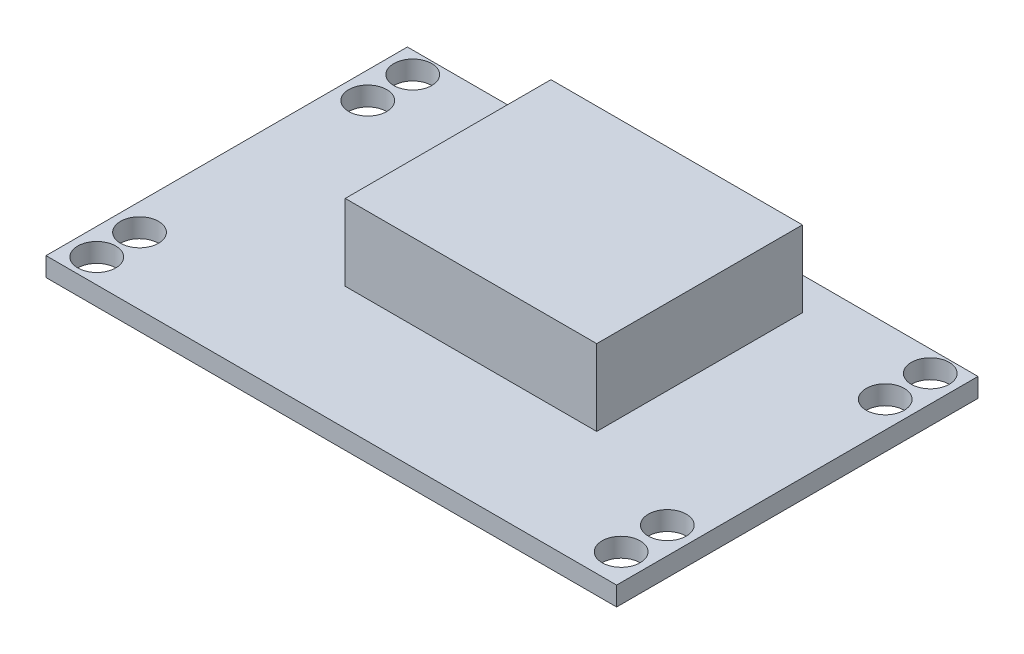
ISO-10303-21;
HEADER;
FILE_DESCRIPTION(('STEP AP214'),'2;1');
FILE_NAME('part.step','',(''),(''),'','','');
FILE_SCHEMA(('AUTOMOTIVE_DESIGN { 1 0 10303 214 1 1 1 1 }'));
ENDSEC;
DATA;
#1=APPLICATION_CONTEXT('core data for automotive mechanical design processes');
#2=APPLICATION_PROTOCOL_DEFINITION('international standard','automotive_design',2000,#1);
#3=PRODUCT_CONTEXT('',#1,'mechanical');
#4=PRODUCT('Part','Part','',(#3));
#5=PRODUCT_RELATED_PRODUCT_CATEGORY('part','',(#4));
#6=PRODUCT_DEFINITION_FORMATION('','',#4);
#7=PRODUCT_DEFINITION_CONTEXT('part definition',#1,'design');
#8=PRODUCT_DEFINITION('design','',#6,#7);
#9=PRODUCT_DEFINITION_SHAPE('','',#8);
#10=(LENGTH_UNIT() NAMED_UNIT(*) SI_UNIT(.MILLI.,.METRE.));
#11=(NAMED_UNIT(*) PLANE_ANGLE_UNIT() SI_UNIT($,.RADIAN.));
#12=(NAMED_UNIT(*) SI_UNIT($,.STERADIAN.) SOLID_ANGLE_UNIT());
#13=UNCERTAINTY_MEASURE_WITH_UNIT(LENGTH_MEASURE(1.E-05),#10,'distance_accuracy_value','');
#14=(GEOMETRIC_REPRESENTATION_CONTEXT(3) GLOBAL_UNCERTAINTY_ASSIGNED_CONTEXT((#13)) GLOBAL_UNIT_ASSIGNED_CONTEXT((#10,
#11,#12)) REPRESENTATION_CONTEXT('',''));
#15=CARTESIAN_POINT('',(0.,0.,0.));
#16=DIRECTION('',(0.,0.,1.));
#17=DIRECTION('',(1.,0.,0.));
#18=AXIS2_PLACEMENT_3D('',#15,#16,#17);
#19=CARTESIAN_POINT('',(0.,1.,0.));
#20=DIRECTION('',(0.,-1.,0.));
#21=DIRECTION('',(0.,0.,-1.));
#22=AXIS2_PLACEMENT_3D('',#19,#20,#21);
#23=PLANE('',#22);
#24=CARTESIAN_POINT('',(28.6035056113575,1.,-1.63484631319741));
#25=DIRECTION('',(0.,1.,0.));
#26=DIRECTION('',(0.,0.,1.));
#27=AXIS2_PLACEMENT_3D('',#24,#25,#26);
#28=CIRCLE('',#27,1.);
#29=CARTESIAN_POINT('',(28.6035056113575,1.,-0.634846313197411));
#30=VERTEX_POINT('',#29);
#31=EDGE_CURVE('E388',#30,#30,#28,.T.);
#32=ORIENTED_EDGE('',*,*,#31,.F.);
#33=EDGE_LOOP('',(#32));
#34=FACE_BOUND('',#33,.T.);
#35=CARTESIAN_POINT('',(1.39649438864245,1.,-1.27369129696668));
#36=DIRECTION('',(0.,1.,0.));
#37=DIRECTION('',(0.,0.,1.));
#38=AXIS2_PLACEMENT_3D('',#35,#36,#37);
#39=CIRCLE('',#38,1.);
#40=CARTESIAN_POINT('',(1.39649438864245,1.,-0.273691296966681));
#41=VERTEX_POINT('',#40);
#42=EDGE_CURVE('E392',#41,#41,#39,.T.);
#43=ORIENTED_EDGE('',*,*,#42,.F.);
#44=EDGE_LOOP('',(#43));
#45=FACE_BOUND('',#44,.T.);
#46=CARTESIAN_POINT('',(1.39649438864245,1.,-3.52087806462456));
#47=DIRECTION('',(0.,1.,0.));
#48=DIRECTION('',(0.,0.,1.));
#49=AXIS2_PLACEMENT_3D('',#46,#47,#48);
#50=CIRCLE('',#49,1.);
#51=CARTESIAN_POINT('',(1.39649438864245,1.,-2.52087806462456));
#52=VERTEX_POINT('',#51);
#53=EDGE_CURVE('E405',#52,#52,#50,.T.);
#54=ORIENTED_EDGE('',*,*,#53,.F.);
#55=EDGE_LOOP('',(#54));
#56=FACE_BOUND('',#55,.T.);
#57=CARTESIAN_POINT('',(1.39649438864245,1.,-15.5192502705122));
#58=DIRECTION('',(0.,1.,0.));
#59=DIRECTION('',(0.,0.,1.));
#60=AXIS2_PLACEMENT_3D('',#57,#58,#59);
#61=CIRCLE('',#60,1.);
#62=CARTESIAN_POINT('',(1.39649438864245,1.,-14.5192502705122));
#63=VERTEX_POINT('',#62);
#64=EDGE_CURVE('E398',#63,#63,#61,.T.);
#65=ORIENTED_EDGE('',*,*,#64,.F.);
#66=EDGE_LOOP('',(#65));
#67=FACE_BOUND('',#66,.T.);
#68=CARTESIAN_POINT('',(28.6035056113575,1.,-15.5192502705122));
#69=DIRECTION('',(0.,1.,0.));
#70=DIRECTION('',(0.,0.,1.));
#71=AXIS2_PLACEMENT_3D('',#68,#69,#70);
#72=CIRCLE('',#71,1.);
#73=CARTESIAN_POINT('',(28.6035056113575,1.,-14.5192502705122));
#74=VERTEX_POINT('',#73);
#75=EDGE_CURVE('E442',#74,#74,#72,.T.);
#76=ORIENTED_EDGE('',*,*,#75,.F.);
#77=EDGE_LOOP('',(#76));
#78=FACE_BOUND('',#77,.T.);
#79=CARTESIAN_POINT('',(28.6035056113575,1.,-17.8868220435803));
#80=DIRECTION('',(0.,1.,0.));
#81=DIRECTION('',(0.,0.,1.));
#82=AXIS2_PLACEMENT_3D('',#79,#80,#81);
#83=CIRCLE('',#82,1.);
#84=CARTESIAN_POINT('',(28.6035056113575,1.,-16.8868220435803));
#85=VERTEX_POINT('',#84);
#86=EDGE_CURVE('E441',#85,#85,#83,.T.);
#87=ORIENTED_EDGE('',*,*,#86,.F.);
#88=EDGE_LOOP('',(#87));
#89=FACE_BOUND('',#88,.T.);
#90=CARTESIAN_POINT('',(28.6035056113575,1.,-4.06261058897066));
#91=DIRECTION('',(0.,1.,0.));
#92=DIRECTION('',(0.,0.,1.));
#93=AXIS2_PLACEMENT_3D('',#90,#91,#92);
#94=CIRCLE('',#93,1.);
#95=CARTESIAN_POINT('',(28.6035056113575,1.,-3.06261058897066));
#96=VERTEX_POINT('',#95);
#97=EDGE_CURVE('E394',#96,#96,#94,.T.);
#98=ORIENTED_EDGE('',*,*,#97,.F.);
#99=EDGE_LOOP('',(#98));
#100=FACE_BOUND('',#99,.T.);
#101=CARTESIAN_POINT('',(1.39649438864245,1.,-17.8868220435803));
#102=DIRECTION('',(0.,1.,0.));
#103=DIRECTION('',(0.,0.,1.));
#104=AXIS2_PLACEMENT_3D('',#101,#102,#103);
#105=CIRCLE('',#104,1.);
#106=CARTESIAN_POINT('',(1.39649438864245,1.,-16.8868220435803));
#107=VERTEX_POINT('',#106);
#108=EDGE_CURVE('E401',#107,#107,#105,.T.);
#109=ORIENTED_EDGE('',*,*,#108,.F.);
#110=EDGE_LOOP('',(#109));
#111=FACE_BOUND('',#110,.T.);
#112=DIRECTION('',(0.,0.,1.));
#113=VECTOR('',#112,1.);
#114=CARTESIAN_POINT('',(0.,1.,0.));
#115=LINE('',#114,#113);
#116=CARTESIAN_POINT('',(0.,1.,-19.));
#117=VERTEX_POINT('',#116);
#118=CARTESIAN_POINT('',(0.,1.,0.));
#119=VERTEX_POINT('',#118);
#120=EDGE_CURVE('E131',#117,#119,#115,.T.);
#121=ORIENTED_EDGE('',*,*,#120,.T.);
#122=DIRECTION('',(1.,0.,0.));
#123=VECTOR('',#122,1.);
#124=CARTESIAN_POINT('',(0.,1.,0.));
#125=LINE('',#124,#123);
#126=CARTESIAN_POINT('',(30.,1.,0.));
#127=VERTEX_POINT('',#126);
#128=EDGE_CURVE('E134',#119,#127,#125,.T.);
#129=ORIENTED_EDGE('',*,*,#128,.T.);
#130=DIRECTION('',(0.,0.,-1.));
#131=VECTOR('',#130,1.);
#132=CARTESIAN_POINT('',(30.,1.,0.));
#133=LINE('',#132,#131);
#134=CARTESIAN_POINT('',(30.,1.,-19.));
#135=VERTEX_POINT('',#134);
#136=EDGE_CURVE('E137',#127,#135,#133,.T.);
#137=ORIENTED_EDGE('',*,*,#136,.T.);
#138=DIRECTION('',(-1.,0.,0.));
#139=VECTOR('',#138,1.);
#140=CARTESIAN_POINT('',(0.,1.,-19.));
#141=LINE('',#140,#139);
#142=EDGE_CURVE('E139',#135,#117,#141,.T.);
#143=ORIENTED_EDGE('',*,*,#142,.T.);
#144=EDGE_LOOP('',(#121,#129,#137,#143));
#145=FACE_BOUND('',#144,.T.);
#146=DIRECTION('',(0.,0.,1.));
#147=VECTOR('',#146,1.);
#148=CARTESIAN_POINT('',(9.26164807544505,1.,-17.2848970165291));
#149=LINE('',#148,#147);
#150=CARTESIAN_POINT('',(9.26164807544505,1.,-17.2848970165291));
#151=VERTEX_POINT('',#150);
#152=CARTESIAN_POINT('',(9.26164807544505,1.,-6.47031069717554));
#153=VERTEX_POINT('',#152);
#154=EDGE_CURVE('E52',#151,#153,#149,.T.);
#155=ORIENTED_EDGE('',*,*,#154,.F.);
#156=DIRECTION('',(-1.,0.,0.));
#157=VECTOR('',#156,1.);
#158=CARTESIAN_POINT('',(9.26164807544505,1.,-17.2848970165291));
#159=LINE('',#158,#157);
#160=CARTESIAN_POINT('',(22.4839345030035,1.,-17.2848970165291));
#161=VERTEX_POINT('',#160);
#162=EDGE_CURVE('E56',#161,#151,#159,.T.);
#163=ORIENTED_EDGE('',*,*,#162,.F.);
#164=DIRECTION('',(0.,0.,-1.));
#165=VECTOR('',#164,1.);
#166=CARTESIAN_POINT('',(22.4839345030035,1.,-17.2848970165291));
#167=LINE('',#166,#165);
#168=CARTESIAN_POINT('',(22.4839345030035,1.,-6.47031069717554));
#169=VERTEX_POINT('',#168);
#170=EDGE_CURVE('E422',#169,#161,#167,.T.);
#171=ORIENTED_EDGE('',*,*,#170,.F.);
#172=DIRECTION('',(1.,0.,0.));
#173=VECTOR('',#172,1.);
#174=CARTESIAN_POINT('',(9.26164807544505,1.,-6.47031069717554));
#175=LINE('',#174,#173);
#176=EDGE_CURVE('E420',#153,#169,#175,.T.);
#177=ORIENTED_EDGE('',*,*,#176,.F.);
#178=EDGE_LOOP('',(#155,#163,#171,#177));
#179=FACE_BOUND('',#178,.T.);
#180=ADVANCED_FACE('F37',(#34,#45,#56,#67,#78,#89,#100,#111,#145,#179),#23,.F.);
#181=CARTESIAN_POINT('',(0.,1.,0.));
#182=DIRECTION('',(1.,0.,0.));
#183=DIRECTION('',(0.,0.,-1.));
#184=AXIS2_PLACEMENT_3D('',#181,#182,#183);
#185=PLANE('',#184);
#186=DIRECTION('',(0.,0.,1.));
#187=VECTOR('',#186,1.);
#188=CARTESIAN_POINT('',(0.,0.,0.));
#189=LINE('',#188,#187);
#190=CARTESIAN_POINT('',(0.,0.,-19.));
#191=VERTEX_POINT('',#190);
#192=CARTESIAN_POINT('',(0.,0.,0.));
#193=VERTEX_POINT('',#192);
#194=EDGE_CURVE('E122',#191,#193,#189,.T.);
#195=ORIENTED_EDGE('',*,*,#194,.T.);
#196=DIRECTION('',(0.,-1.,0.));
#197=VECTOR('',#196,1.);
#198=CARTESIAN_POINT('',(0.,1.,0.));
#199=LINE('',#198,#197);
#200=EDGE_CURVE('E11',#119,#193,#199,.T.);
#201=ORIENTED_EDGE('',*,*,#200,.F.);
#202=ORIENTED_EDGE('',*,*,#120,.F.);
#203=DIRECTION('',(0.,-1.,0.));
#204=VECTOR('',#203,1.);
#205=CARTESIAN_POINT('',(0.,1.,-19.));
#206=LINE('',#205,#204);
#207=EDGE_CURVE('E140',#117,#191,#206,.T.);
#208=ORIENTED_EDGE('',*,*,#207,.T.);
#209=EDGE_LOOP('',(#195,#201,#202,#208));
#210=FACE_BOUND('',#209,.T.);
#211=ADVANCED_FACE('F39',(#210),#185,.F.);
#212=CARTESIAN_POINT('',(0.,1.,0.));
#213=DIRECTION('',(0.,0.,-1.));
#214=DIRECTION('',(-1.,0.,0.));
#215=AXIS2_PLACEMENT_3D('',#212,#213,#214);
#216=PLANE('',#215);
#217=DIRECTION('',(1.,0.,0.));
#218=VECTOR('',#217,1.);
#219=CARTESIAN_POINT('',(0.,0.,0.));
#220=LINE('',#219,#218);
#221=CARTESIAN_POINT('',(30.,0.,0.));
#222=VERTEX_POINT('',#221);
#223=EDGE_CURVE('E125',#193,#222,#220,.T.);
#224=ORIENTED_EDGE('',*,*,#223,.T.);
#225=DIRECTION('',(0.,-1.,0.));
#226=VECTOR('',#225,1.);
#227=CARTESIAN_POINT('',(30.,1.,0.));
#228=LINE('',#227,#226);
#229=EDGE_CURVE('E45',#127,#222,#228,.T.);
#230=ORIENTED_EDGE('',*,*,#229,.F.);
#231=ORIENTED_EDGE('',*,*,#128,.F.);
#232=ORIENTED_EDGE('',*,*,#200,.T.);
#233=EDGE_LOOP('',(#224,#230,#231,#232));
#234=FACE_BOUND('',#233,.T.);
#235=ADVANCED_FACE('F170',(#234),#216,.F.);
#236=CARTESIAN_POINT('',(30.,1.,0.));
#237=DIRECTION('',(-1.,0.,0.));
#238=DIRECTION('',(0.,0.,1.));
#239=AXIS2_PLACEMENT_3D('',#236,#237,#238);
#240=PLANE('',#239);
#241=DIRECTION('',(0.,0.,-1.));
#242=VECTOR('',#241,1.);
#243=CARTESIAN_POINT('',(30.,0.,0.));
#244=LINE('',#243,#242);
#245=CARTESIAN_POINT('',(30.,0.,-19.));
#246=VERTEX_POINT('',#245);
#247=EDGE_CURVE('E143',#222,#246,#244,.T.);
#248=ORIENTED_EDGE('',*,*,#247,.T.);
#249=DIRECTION('',(0.,-1.,0.));
#250=VECTOR('',#249,1.);
#251=CARTESIAN_POINT('',(30.,1.,-19.));
#252=LINE('',#251,#250);
#253=EDGE_CURVE('E148',#135,#246,#252,.T.);
#254=ORIENTED_EDGE('',*,*,#253,.F.);
#255=ORIENTED_EDGE('',*,*,#136,.F.);
#256=ORIENTED_EDGE('',*,*,#229,.T.);
#257=EDGE_LOOP('',(#248,#254,#255,#256));
#258=FACE_BOUND('',#257,.T.);
#259=ADVANCED_FACE('F155',(#258),#240,.F.);
#260=CARTESIAN_POINT('',(0.,1.,-19.));
#261=DIRECTION('',(0.,0.,1.));
#262=DIRECTION('',(1.,0.,0.));
#263=AXIS2_PLACEMENT_3D('',#260,#261,#262);
#264=PLANE('',#263);
#265=DIRECTION('',(-1.,0.,0.));
#266=VECTOR('',#265,1.);
#267=CARTESIAN_POINT('',(0.,0.,-19.));
#268=LINE('',#267,#266);
#269=EDGE_CURVE('E135',#246,#191,#268,.T.);
#270=ORIENTED_EDGE('',*,*,#269,.T.);
#271=ORIENTED_EDGE('',*,*,#207,.F.);
#272=ORIENTED_EDGE('',*,*,#142,.F.);
#273=ORIENTED_EDGE('',*,*,#253,.T.);
#274=EDGE_LOOP('',(#270,#271,#272,#273));
#275=FACE_BOUND('',#274,.T.);
#276=ADVANCED_FACE('F164',(#275),#264,.F.);
#277=CARTESIAN_POINT('',(0.,0.,0.));
#278=DIRECTION('',(0.,-1.,0.));
#279=DIRECTION('',(0.,0.,-1.));
#280=AXIS2_PLACEMENT_3D('',#277,#278,#279);
#281=PLANE('',#280);
#282=CARTESIAN_POINT('',(28.6035056113575,0.,-1.63484631319741));
#283=DIRECTION('',(0.,1.,0.));
#284=DIRECTION('',(0.,0.,1.));
#285=AXIS2_PLACEMENT_3D('',#282,#283,#284);
#286=CIRCLE('',#285,1.);
#287=CARTESIAN_POINT('',(28.6035056113575,0.,-0.634846313197411));
#288=VERTEX_POINT('',#287);
#289=EDGE_CURVE('E386',#288,#288,#286,.T.);
#290=ORIENTED_EDGE('',*,*,#289,.T.);
#291=EDGE_LOOP('',(#290));
#292=FACE_BOUND('',#291,.T.);
#293=CARTESIAN_POINT('',(1.39649438864245,0.,-1.27369129696668));
#294=DIRECTION('',(0.,1.,0.));
#295=DIRECTION('',(0.,0.,1.));
#296=AXIS2_PLACEMENT_3D('',#293,#294,#295);
#297=CIRCLE('',#296,1.);
#298=CARTESIAN_POINT('',(1.39649438864245,0.,-0.273691296966681));
#299=VERTEX_POINT('',#298);
#300=EDGE_CURVE('E389',#299,#299,#297,.T.);
#301=ORIENTED_EDGE('',*,*,#300,.T.);
#302=EDGE_LOOP('',(#301));
#303=FACE_BOUND('',#302,.T.);
#304=CARTESIAN_POINT('',(1.39649438864245,0.,-3.52087806462456));
#305=DIRECTION('',(0.,1.,0.));
#306=DIRECTION('',(0.,0.,1.));
#307=AXIS2_PLACEMENT_3D('',#304,#305,#306);
#308=CIRCLE('',#307,1.);
#309=CARTESIAN_POINT('',(1.39649438864245,0.,-2.52087806462456));
#310=VERTEX_POINT('',#309);
#311=EDGE_CURVE('E408',#310,#310,#308,.T.);
#312=ORIENTED_EDGE('',*,*,#311,.T.);
#313=EDGE_LOOP('',(#312));
#314=FACE_BOUND('',#313,.T.);
#315=CARTESIAN_POINT('',(1.39649438864245,0.,-15.5192502705122));
#316=DIRECTION('',(0.,1.,0.));
#317=DIRECTION('',(0.,0.,1.));
#318=AXIS2_PLACEMENT_3D('',#315,#316,#317);
#319=CIRCLE('',#318,1.);
#320=CARTESIAN_POINT('',(1.39649438864245,0.,-14.5192502705122));
#321=VERTEX_POINT('',#320);
#322=EDGE_CURVE('E402',#321,#321,#319,.T.);
#323=ORIENTED_EDGE('',*,*,#322,.T.);
#324=EDGE_LOOP('',(#323));
#325=FACE_BOUND('',#324,.T.);
#326=CARTESIAN_POINT('',(28.6035056113575,0.,-15.5192502705122));
#327=DIRECTION('',(0.,1.,0.));
#328=DIRECTION('',(0.,0.,1.));
#329=AXIS2_PLACEMENT_3D('',#326,#327,#328);
#330=CIRCLE('',#329,1.);
#331=CARTESIAN_POINT('',(28.6035056113575,0.,-14.5192502705122));
#332=VERTEX_POINT('',#331);
#333=EDGE_CURVE('E450',#332,#332,#330,.T.);
#334=ORIENTED_EDGE('',*,*,#333,.T.);
#335=EDGE_LOOP('',(#334));
#336=FACE_BOUND('',#335,.T.);
#337=CARTESIAN_POINT('',(28.6035056113575,0.,-17.8868220435803));
#338=DIRECTION('',(0.,1.,0.));
#339=DIRECTION('',(0.,0.,1.));
#340=AXIS2_PLACEMENT_3D('',#337,#338,#339);
#341=CIRCLE('',#340,1.);
#342=CARTESIAN_POINT('',(28.6035056113575,0.,-16.8868220435803));
#343=VERTEX_POINT('',#342);
#344=EDGE_CURVE('E438',#343,#343,#341,.T.);
#345=ORIENTED_EDGE('',*,*,#344,.T.);
#346=EDGE_LOOP('',(#345));
#347=FACE_BOUND('',#346,.T.);
#348=CARTESIAN_POINT('',(28.6035056113575,0.,-4.06261058897066));
#349=DIRECTION('',(0.,1.,0.));
#350=DIRECTION('',(0.,0.,1.));
#351=AXIS2_PLACEMENT_3D('',#348,#349,#350);
#352=CIRCLE('',#351,1.);
#353=CARTESIAN_POINT('',(28.6035056113575,0.,-3.06261058897066));
#354=VERTEX_POINT('',#353);
#355=EDGE_CURVE('E445',#354,#354,#352,.T.);
#356=ORIENTED_EDGE('',*,*,#355,.T.);
#357=EDGE_LOOP('',(#356));
#358=FACE_BOUND('',#357,.T.);
#359=CARTESIAN_POINT('',(1.39649438864245,0.,-17.8868220435803));
#360=DIRECTION('',(0.,1.,0.));
#361=DIRECTION('',(0.,0.,1.));
#362=AXIS2_PLACEMENT_3D('',#359,#360,#361);
#363=CIRCLE('',#362,1.);
#364=CARTESIAN_POINT('',(1.39649438864245,0.,-16.8868220435803));
#365=VERTEX_POINT('',#364);
#366=EDGE_CURVE('E411',#365,#365,#363,.T.);
#367=ORIENTED_EDGE('',*,*,#366,.T.);
#368=EDGE_LOOP('',(#367));
#369=FACE_BOUND('',#368,.T.);
#370=ORIENTED_EDGE('',*,*,#194,.F.);
#371=ORIENTED_EDGE('',*,*,#269,.F.);
#372=ORIENTED_EDGE('',*,*,#247,.F.);
#373=ORIENTED_EDGE('',*,*,#223,.F.);
#374=EDGE_LOOP('',(#370,#371,#372,#373));
#375=FACE_BOUND('',#374,.T.);
#376=ADVANCED_FACE('F161',(#292,#303,#314,#325,#336,#347,#358,#369,#375),#281,.T.);
#377=CARTESIAN_POINT('',(9.26164807544505,5.,-17.2848970165291));
#378=DIRECTION('',(1.,0.,0.));
#379=DIRECTION('',(0.,0.,-1.));
#380=AXIS2_PLACEMENT_3D('',#377,#378,#379);
#381=PLANE('',#380);
#382=ORIENTED_EDGE('',*,*,#154,.T.);
#383=DIRECTION('',(0.,-1.,0.));
#384=VECTOR('',#383,1.);
#385=CARTESIAN_POINT('',(9.26164807544505,5.,-6.47031069717554));
#386=LINE('',#385,#384);
#387=CARTESIAN_POINT('',(9.26164807544505,5.,-6.47031069717554));
#388=VERTEX_POINT('',#387);
#389=EDGE_CURVE('E105',#388,#153,#386,.T.);
#390=ORIENTED_EDGE('',*,*,#389,.F.);
#391=DIRECTION('',(0.,0.,1.));
#392=VECTOR('',#391,1.);
#393=CARTESIAN_POINT('',(9.26164807544505,5.,-17.2848970165291));
#394=LINE('',#393,#392);
#395=CARTESIAN_POINT('',(9.26164807544505,5.,-17.2848970165291));
#396=VERTEX_POINT('',#395);
#397=EDGE_CURVE('E111',#396,#388,#394,.T.);
#398=ORIENTED_EDGE('',*,*,#397,.F.);
#399=DIRECTION('',(0.,-1.,0.));
#400=VECTOR('',#399,1.);
#401=CARTESIAN_POINT('',(9.26164807544505,5.,-17.2848970165291));
#402=LINE('',#401,#400);
#403=EDGE_CURVE('E418',#396,#151,#402,.T.);
#404=ORIENTED_EDGE('',*,*,#403,.T.);
#405=EDGE_LOOP('',(#382,#390,#398,#404));
#406=FACE_BOUND('',#405,.T.);
#407=ADVANCED_FACE('F121',(#406),#381,.F.);
#408=CARTESIAN_POINT('',(9.26164807544505,5.,-6.47031069717554));
#409=DIRECTION('',(0.,0.,-1.));
#410=DIRECTION('',(-1.,0.,0.));
#411=AXIS2_PLACEMENT_3D('',#408,#409,#410);
#412=PLANE('',#411);
#413=ORIENTED_EDGE('',*,*,#176,.T.);
#414=DIRECTION('',(0.,-1.,0.));
#415=VECTOR('',#414,1.);
#416=CARTESIAN_POINT('',(22.4839345030035,5.,-6.47031069717554));
#417=LINE('',#416,#415);
#418=CARTESIAN_POINT('',(22.4839345030035,5.,-6.47031069717554));
#419=VERTEX_POINT('',#418);
#420=EDGE_CURVE('E107',#419,#169,#417,.T.);
#421=ORIENTED_EDGE('',*,*,#420,.F.);
#422=DIRECTION('',(1.,0.,0.));
#423=VECTOR('',#422,1.);
#424=CARTESIAN_POINT('',(9.26164807544505,5.,-6.47031069717554));
#425=LINE('',#424,#423);
#426=EDGE_CURVE('E100',#388,#419,#425,.T.);
#427=ORIENTED_EDGE('',*,*,#426,.F.);
#428=ORIENTED_EDGE('',*,*,#389,.T.);
#429=EDGE_LOOP('',(#413,#421,#427,#428));
#430=FACE_BOUND('',#429,.T.);
#431=ADVANCED_FACE('F103',(#430),#412,.F.);
#432=CARTESIAN_POINT('',(22.4839345030035,5.,-17.2848970165291));
#433=DIRECTION('',(-1.,0.,0.));
#434=DIRECTION('',(0.,0.,1.));
#435=AXIS2_PLACEMENT_3D('',#432,#433,#434);
#436=PLANE('',#435);
#437=ORIENTED_EDGE('',*,*,#170,.T.);
#438=DIRECTION('',(0.,-1.,0.));
#439=VECTOR('',#438,1.);
#440=CARTESIAN_POINT('',(22.4839345030035,5.,-17.2848970165291));
#441=LINE('',#440,#439);
#442=CARTESIAN_POINT('',(22.4839345030035,5.,-17.2848970165291));
#443=VERTEX_POINT('',#442);
#444=EDGE_CURVE('E127',#443,#161,#441,.T.);
#445=ORIENTED_EDGE('',*,*,#444,.F.);
#446=DIRECTION('',(0.,0.,-1.));
#447=VECTOR('',#446,1.);
#448=CARTESIAN_POINT('',(22.4839345030035,5.,-17.2848970165291));
#449=LINE('',#448,#447);
#450=EDGE_CURVE('E110',#419,#443,#449,.T.);
#451=ORIENTED_EDGE('',*,*,#450,.F.);
#452=ORIENTED_EDGE('',*,*,#420,.T.);
#453=EDGE_LOOP('',(#437,#445,#451,#452));
#454=FACE_BOUND('',#453,.T.);
#455=ADVANCED_FACE('F211',(#454),#436,.F.);
#456=CARTESIAN_POINT('',(9.26164807544505,5.,-17.2848970165291));
#457=DIRECTION('',(0.,0.,1.));
#458=DIRECTION('',(1.,0.,0.));
#459=AXIS2_PLACEMENT_3D('',#456,#457,#458);
#460=PLANE('',#459);
#461=ORIENTED_EDGE('',*,*,#162,.T.);
#462=ORIENTED_EDGE('',*,*,#403,.F.);
#463=DIRECTION('',(-1.,0.,0.));
#464=VECTOR('',#463,1.);
#465=CARTESIAN_POINT('',(9.26164807544505,5.,-17.2848970165291));
#466=LINE('',#465,#464);
#467=EDGE_CURVE('E116',#443,#396,#466,.T.);
#468=ORIENTED_EDGE('',*,*,#467,.F.);
#469=ORIENTED_EDGE('',*,*,#444,.T.);
#470=EDGE_LOOP('',(#461,#462,#468,#469));
#471=FACE_BOUND('',#470,.T.);
#472=ADVANCED_FACE('F217',(#471),#460,.F.);
#473=CARTESIAN_POINT('',(0.,5.,0.));
#474=DIRECTION('',(0.,1.,0.));
#475=DIRECTION('',(0.,0.,1.));
#476=AXIS2_PLACEMENT_3D('',#473,#474,#475);
#477=PLANE('',#476);
#478=ORIENTED_EDGE('',*,*,#397,.T.);
#479=ORIENTED_EDGE('',*,*,#426,.T.);
#480=ORIENTED_EDGE('',*,*,#450,.T.);
#481=ORIENTED_EDGE('',*,*,#467,.T.);
#482=EDGE_LOOP('',(#478,#479,#480,#481));
#483=FACE_BOUND('',#482,.T.);
#484=ADVANCED_FACE('F114',(#483),#477,.T.);
#485=CARTESIAN_POINT('',(1.39649438864245,0.,-17.8868220435803));
#486=DIRECTION('',(0.,1.,0.));
#487=DIRECTION('',(0.,0.,1.));
#488=AXIS2_PLACEMENT_3D('',#485,#486,#487);
#489=CYLINDRICAL_SURFACE('',#488,1.);
#490=ORIENTED_EDGE('',*,*,#366,.F.);
#491=EDGE_LOOP('',(#490));
#492=FACE_BOUND('',#491,.T.);
#493=ORIENTED_EDGE('',*,*,#108,.T.);
#494=EDGE_LOOP('',(#493));
#495=FACE_BOUND('',#494,.T.);
#496=ADVANCED_FACE('F232',(#492,#495),#489,.F.);
#497=CARTESIAN_POINT('',(28.6035056113575,0.,-4.06261058897066));
#498=DIRECTION('',(0.,1.,0.));
#499=DIRECTION('',(0.,0.,1.));
#500=AXIS2_PLACEMENT_3D('',#497,#498,#499);
#501=CYLINDRICAL_SURFACE('',#500,1.);
#502=ORIENTED_EDGE('',*,*,#355,.F.);
#503=EDGE_LOOP('',(#502));
#504=FACE_BOUND('',#503,.T.);
#505=ORIENTED_EDGE('',*,*,#97,.T.);
#506=EDGE_LOOP('',(#505));
#507=FACE_BOUND('',#506,.T.);
#508=ADVANCED_FACE('F238',(#504,#507),#501,.F.);
#509=CARTESIAN_POINT('',(28.6035056113575,0.,-17.8868220435803));
#510=DIRECTION('',(0.,1.,0.));
#511=DIRECTION('',(0.,0.,1.));
#512=AXIS2_PLACEMENT_3D('',#509,#510,#511);
#513=CYLINDRICAL_SURFACE('',#512,1.);
#514=ORIENTED_EDGE('',*,*,#344,.F.);
#515=EDGE_LOOP('',(#514));
#516=FACE_BOUND('',#515,.T.);
#517=ORIENTED_EDGE('',*,*,#86,.T.);
#518=EDGE_LOOP('',(#517));
#519=FACE_BOUND('',#518,.T.);
#520=ADVANCED_FACE('F246',(#516,#519),#513,.F.);
#521=CARTESIAN_POINT('',(28.6035056113575,0.,-15.5192502705122));
#522=DIRECTION('',(0.,1.,0.));
#523=DIRECTION('',(0.,0.,1.));
#524=AXIS2_PLACEMENT_3D('',#521,#522,#523);
#525=CYLINDRICAL_SURFACE('',#524,1.);
#526=ORIENTED_EDGE('',*,*,#333,.F.);
#527=EDGE_LOOP('',(#526));
#528=FACE_BOUND('',#527,.T.);
#529=ORIENTED_EDGE('',*,*,#75,.T.);
#530=EDGE_LOOP('',(#529));
#531=FACE_BOUND('',#530,.T.);
#532=ADVANCED_FACE('F254',(#528,#531),#525,.F.);
#533=CARTESIAN_POINT('',(1.39649438864245,0.,-15.5192502705122));
#534=DIRECTION('',(0.,1.,0.));
#535=DIRECTION('',(0.,0.,1.));
#536=AXIS2_PLACEMENT_3D('',#533,#534,#535);
#537=CYLINDRICAL_SURFACE('',#536,1.);
#538=ORIENTED_EDGE('',*,*,#322,.F.);
#539=EDGE_LOOP('',(#538));
#540=FACE_BOUND('',#539,.T.);
#541=ORIENTED_EDGE('',*,*,#64,.T.);
#542=EDGE_LOOP('',(#541));
#543=FACE_BOUND('',#542,.T.);
#544=ADVANCED_FACE('F262',(#540,#543),#537,.F.);
#545=CARTESIAN_POINT('',(1.39649438864245,0.,-3.52087806462456));
#546=DIRECTION('',(0.,1.,0.));
#547=DIRECTION('',(0.,0.,1.));
#548=AXIS2_PLACEMENT_3D('',#545,#546,#547);
#549=CYLINDRICAL_SURFACE('',#548,1.);
#550=ORIENTED_EDGE('',*,*,#311,.F.);
#551=EDGE_LOOP('',(#550));
#552=FACE_BOUND('',#551,.T.);
#553=ORIENTED_EDGE('',*,*,#53,.T.);
#554=EDGE_LOOP('',(#553));
#555=FACE_BOUND('',#554,.T.);
#556=ADVANCED_FACE('F270',(#552,#555),#549,.F.);
#557=CARTESIAN_POINT('',(1.39649438864245,0.,-1.27369129696668));
#558=DIRECTION('',(0.,1.,0.));
#559=DIRECTION('',(0.,0.,1.));
#560=AXIS2_PLACEMENT_3D('',#557,#558,#559);
#561=CYLINDRICAL_SURFACE('',#560,1.);
#562=ORIENTED_EDGE('',*,*,#300,.F.);
#563=EDGE_LOOP('',(#562));
#564=FACE_BOUND('',#563,.T.);
#565=ORIENTED_EDGE('',*,*,#42,.T.);
#566=EDGE_LOOP('',(#565));
#567=FACE_BOUND('',#566,.T.);
#568=ADVANCED_FACE('F278',(#564,#567),#561,.F.);
#569=CARTESIAN_POINT('',(28.6035056113575,0.,-1.63484631319741));
#570=DIRECTION('',(0.,1.,0.));
#571=DIRECTION('',(0.,0.,1.));
#572=AXIS2_PLACEMENT_3D('',#569,#570,#571);
#573=CYLINDRICAL_SURFACE('',#572,1.);
#574=ORIENTED_EDGE('',*,*,#289,.F.);
#575=EDGE_LOOP('',(#574));
#576=FACE_BOUND('',#575,.T.);
#577=ORIENTED_EDGE('',*,*,#31,.T.);
#578=EDGE_LOOP('',(#577));
#579=FACE_BOUND('',#578,.T.);
#580=ADVANCED_FACE('F286',(#576,#579),#573,.F.);
#581=CLOSED_SHELL('',(#180,#211,#235,#259,#276,#376,#407,#431,#455,#472,#484,#496,#508,#520,
#532,#544,#556,#568,#580));
#582=MANIFOLD_SOLID_BREP('B2',#581);
#583=ADVANCED_BREP_SHAPE_REPRESENTATION('',(#18,#582),#14);
#584=SHAPE_DEFINITION_REPRESENTATION(#9,#583);
ENDSEC;
END-ISO-10303-21;
